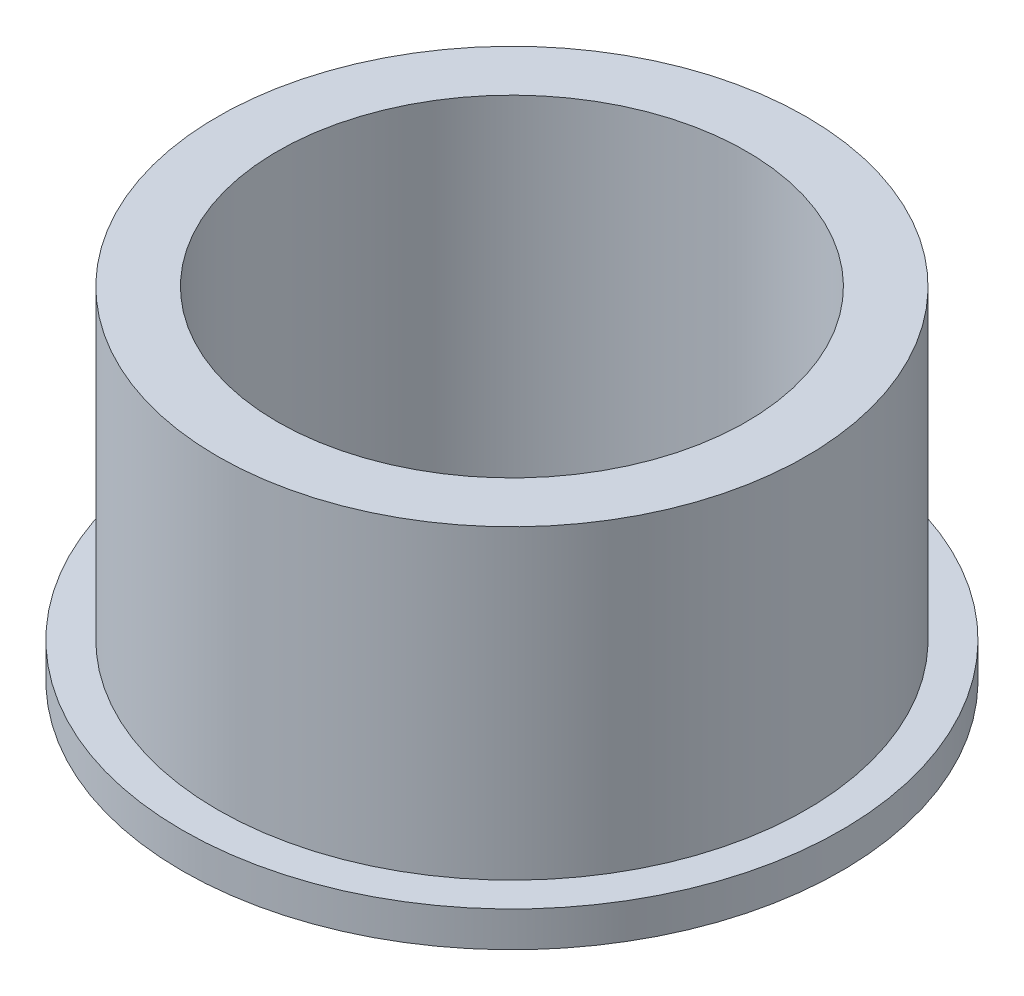
ISO-10303-21;
HEADER;
FILE_DESCRIPTION(('STEP AP214'),'2;1');
FILE_NAME('part.step','',(''),(''),'','','');
FILE_SCHEMA(('AUTOMOTIVE_DESIGN { 1 0 10303 214 1 1 1 1 }'));
ENDSEC;
DATA;
#1=APPLICATION_CONTEXT('core data for automotive mechanical design processes');
#2=APPLICATION_PROTOCOL_DEFINITION('international standard','automotive_design',2000,#1);
#3=PRODUCT_CONTEXT('',#1,'mechanical');
#4=PRODUCT('Part','Part','',(#3));
#5=PRODUCT_RELATED_PRODUCT_CATEGORY('part','',(#4));
#6=PRODUCT_DEFINITION_FORMATION('','',#4);
#7=PRODUCT_DEFINITION_CONTEXT('part definition',#1,'design');
#8=PRODUCT_DEFINITION('design','',#6,#7);
#9=PRODUCT_DEFINITION_SHAPE('','',#8);
#10=(LENGTH_UNIT() NAMED_UNIT(*) SI_UNIT(.MILLI.,.METRE.));
#11=(NAMED_UNIT(*) PLANE_ANGLE_UNIT() SI_UNIT($,.RADIAN.));
#12=(NAMED_UNIT(*) SI_UNIT($,.STERADIAN.) SOLID_ANGLE_UNIT());
#13=UNCERTAINTY_MEASURE_WITH_UNIT(LENGTH_MEASURE(1.E-05),#10,'distance_accuracy_value','');
#14=(GEOMETRIC_REPRESENTATION_CONTEXT(3) GLOBAL_UNCERTAINTY_ASSIGNED_CONTEXT((#13)) GLOBAL_UNIT_ASSIGNED_CONTEXT((#10,
#11,#12)) REPRESENTATION_CONTEXT('',''));
#15=CARTESIAN_POINT('',(0.,0.,0.));
#16=DIRECTION('',(0.,0.,1.));
#17=DIRECTION('',(1.,0.,0.));
#18=AXIS2_PLACEMENT_3D('',#15,#16,#17);
#19=CARTESIAN_POINT('',(0.,7.41285661184654,0.));
#20=DIRECTION('',(0.,1.,0.));
#21=DIRECTION('',(0.,0.,1.));
#22=AXIS2_PLACEMENT_3D('',#19,#20,#21);
#23=CYLINDRICAL_SURFACE('',#22,3.0353);
#24=CARTESIAN_POINT('',(0.,0.,0.));
#25=DIRECTION('',(0.,1.,0.));
#26=DIRECTION('',(0.,0.,1.));
#27=AXIS2_PLACEMENT_3D('',#24,#25,#26);
#28=CIRCLE('',#27,3.0353);
#29=CARTESIAN_POINT('',(0.,0.,3.0353));
#30=VERTEX_POINT('',#29);
#31=EDGE_CURVE('E10',#30,#30,#28,.T.);
#32=ORIENTED_EDGE('',*,*,#31,.F.);
#33=EDGE_LOOP('',(#32));
#34=FACE_BOUND('',#33,.T.);
#35=CARTESIAN_POINT('',(0.,4.4196,0.));
#36=DIRECTION('',(0.,1.,0.));
#37=DIRECTION('',(0.,0.,1.));
#38=AXIS2_PLACEMENT_3D('',#35,#36,#37);
#39=CIRCLE('',#38,3.0353);
#40=CARTESIAN_POINT('',(0.,4.4196,3.0353));
#41=VERTEX_POINT('',#40);
#42=EDGE_CURVE('E53',#41,#41,#39,.T.);
#43=ORIENTED_EDGE('',*,*,#42,.T.);
#44=EDGE_LOOP('',(#43));
#45=FACE_BOUND('',#44,.T.);
#46=ADVANCED_FACE('F31',(#34,#45),#23,.F.);
#47=CARTESIAN_POINT('',(0.,0.,-3.0353));
#48=DIRECTION('',(0.,1.,0.));
#49=DIRECTION('',(0.,0.,1.));
#50=AXIS2_PLACEMENT_3D('',#47,#48,#49);
#51=PLANE('',#50);
#52=CARTESIAN_POINT('',(0.,0.,0.));
#53=DIRECTION('',(0.,1.,0.));
#54=DIRECTION('',(0.,0.,1.));
#55=AXIS2_PLACEMENT_3D('',#52,#53,#54);
#56=CIRCLE('',#55,4.2672);
#57=CARTESIAN_POINT('',(0.,0.,4.2672));
#58=VERTEX_POINT('',#57);
#59=EDGE_CURVE('E37',#58,#58,#56,.T.);
#60=ORIENTED_EDGE('',*,*,#59,.F.);
#61=EDGE_LOOP('',(#60));
#62=FACE_BOUND('',#61,.T.);
#63=ORIENTED_EDGE('',*,*,#31,.T.);
#64=EDGE_LOOP('',(#63));
#65=FACE_BOUND('',#64,.T.);
#66=ADVANCED_FACE('F78',(#62,#65),#51,.F.);
#67=CARTESIAN_POINT('',(0.,7.41285661184654,0.));
#68=DIRECTION('',(0.,1.,0.));
#69=DIRECTION('',(0.,0.,1.));
#70=AXIS2_PLACEMENT_3D('',#67,#68,#69);
#71=CYLINDRICAL_SURFACE('',#70,4.2672);
#72=CARTESIAN_POINT('',(0.,0.4572,0.));
#73=DIRECTION('',(0.,1.,0.));
#74=DIRECTION('',(0.,0.,1.));
#75=AXIS2_PLACEMENT_3D('',#72,#73,#74);
#76=CIRCLE('',#75,4.2672);
#77=CARTESIAN_POINT('',(0.,0.4572,4.2672));
#78=VERTEX_POINT('',#77);
#79=EDGE_CURVE('E41',#78,#78,#76,.T.);
#80=ORIENTED_EDGE('',*,*,#79,.F.);
#81=EDGE_LOOP('',(#80));
#82=FACE_BOUND('',#81,.T.);
#83=ORIENTED_EDGE('',*,*,#59,.T.);
#84=EDGE_LOOP('',(#83));
#85=FACE_BOUND('',#84,.T.);
#86=ADVANCED_FACE('F73',(#82,#85),#71,.T.);
#87=CARTESIAN_POINT('',(0.,0.4572,-4.2672));
#88=DIRECTION('',(0.,-1.,0.));
#89=DIRECTION('',(0.,0.,-1.));
#90=AXIS2_PLACEMENT_3D('',#87,#88,#89);
#91=PLANE('',#90);
#92=CARTESIAN_POINT('',(0.,0.4572,0.));
#93=DIRECTION('',(0.,1.,0.));
#94=DIRECTION('',(0.,0.,1.));
#95=AXIS2_PLACEMENT_3D('',#92,#93,#94);
#96=CIRCLE('',#95,3.81);
#97=CARTESIAN_POINT('',(0.,0.4572,3.81));
#98=VERTEX_POINT('',#97);
#99=EDGE_CURVE('E45',#98,#98,#96,.T.);
#100=ORIENTED_EDGE('',*,*,#99,.F.);
#101=EDGE_LOOP('',(#100));
#102=FACE_BOUND('',#101,.T.);
#103=ORIENTED_EDGE('',*,*,#79,.T.);
#104=EDGE_LOOP('',(#103));
#105=FACE_BOUND('',#104,.T.);
#106=ADVANCED_FACE('F67',(#102,#105),#91,.F.);
#107=CARTESIAN_POINT('',(0.,7.41285661184654,0.));
#108=DIRECTION('',(0.,1.,0.));
#109=DIRECTION('',(0.,0.,1.));
#110=AXIS2_PLACEMENT_3D('',#107,#108,#109);
#111=CYLINDRICAL_SURFACE('',#110,3.81);
#112=CARTESIAN_POINT('',(0.,4.4196,0.));
#113=DIRECTION('',(0.,1.,0.));
#114=DIRECTION('',(0.,0.,1.));
#115=AXIS2_PLACEMENT_3D('',#112,#113,#114);
#116=CIRCLE('',#115,3.81);
#117=CARTESIAN_POINT('',(0.,4.4196,3.81));
#118=VERTEX_POINT('',#117);
#119=EDGE_CURVE('E50',#118,#118,#116,.T.);
#120=ORIENTED_EDGE('',*,*,#119,.F.);
#121=EDGE_LOOP('',(#120));
#122=FACE_BOUND('',#121,.T.);
#123=ORIENTED_EDGE('',*,*,#99,.T.);
#124=EDGE_LOOP('',(#123));
#125=FACE_BOUND('',#124,.T.);
#126=ADVANCED_FACE('F61',(#122,#125),#111,.T.);
#127=CARTESIAN_POINT('',(0.,4.4196,-3.81));
#128=DIRECTION('',(0.,-1.,0.));
#129=DIRECTION('',(0.,0.,-1.));
#130=AXIS2_PLACEMENT_3D('',#127,#128,#129);
#131=PLANE('',#130);
#132=ORIENTED_EDGE('',*,*,#42,.F.);
#133=EDGE_LOOP('',(#132));
#134=FACE_BOUND('',#133,.T.);
#135=ORIENTED_EDGE('',*,*,#119,.T.);
#136=EDGE_LOOP('',(#135));
#137=FACE_BOUND('',#136,.T.);
#138=ADVANCED_FACE('F58',(#134,#137),#131,.F.);
#139=CLOSED_SHELL('',(#46,#66,#86,#106,#126,#138));
#140=MANIFOLD_SOLID_BREP('B2',#139);
#141=ADVANCED_BREP_SHAPE_REPRESENTATION('',(#18,#140),#14);
#142=SHAPE_DEFINITION_REPRESENTATION(#9,#141);
ENDSEC;
END-ISO-10303-21;
